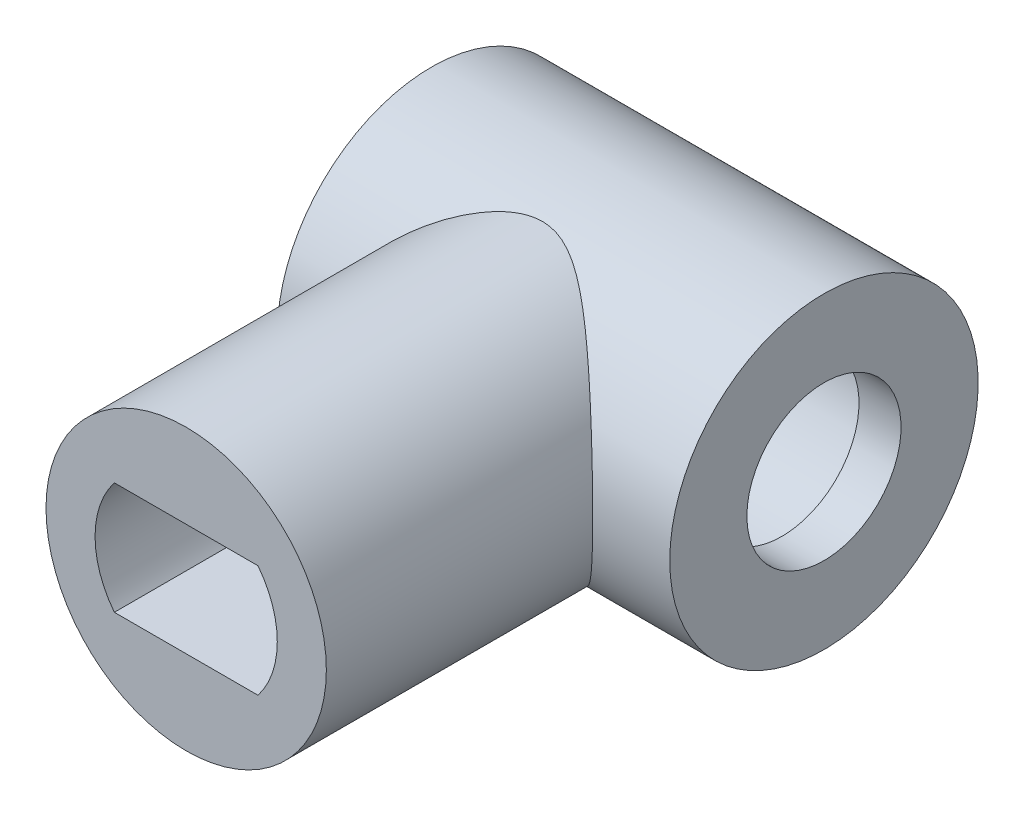
ISO-10303-21;
HEADER;
FILE_DESCRIPTION(('STEP AP214'),'2;1');
FILE_NAME('part.step','',(''),(''),'','','');
FILE_SCHEMA(('AUTOMOTIVE_DESIGN { 1 0 10303 214 1 1 1 1 }'));
ENDSEC;
DATA;
#1=APPLICATION_CONTEXT('core data for automotive mechanical design processes');
#2=APPLICATION_PROTOCOL_DEFINITION('international standard','automotive_design',2000,#1);
#3=PRODUCT_CONTEXT('',#1,'mechanical');
#4=PRODUCT('Part','Part','',(#3));
#5=PRODUCT_RELATED_PRODUCT_CATEGORY('part','',(#4));
#6=PRODUCT_DEFINITION_FORMATION('','',#4);
#7=PRODUCT_DEFINITION_CONTEXT('part definition',#1,'design');
#8=PRODUCT_DEFINITION('design','',#6,#7);
#9=PRODUCT_DEFINITION_SHAPE('','',#8);
#10=(LENGTH_UNIT() NAMED_UNIT(*) SI_UNIT(.MILLI.,.METRE.));
#11=(NAMED_UNIT(*) PLANE_ANGLE_UNIT() SI_UNIT($,.RADIAN.));
#12=(NAMED_UNIT(*) SI_UNIT($,.STERADIAN.) SOLID_ANGLE_UNIT());
#13=UNCERTAINTY_MEASURE_WITH_UNIT(LENGTH_MEASURE(1.E-05),#10,'distance_accuracy_value','');
#14=(GEOMETRIC_REPRESENTATION_CONTEXT(3) GLOBAL_UNCERTAINTY_ASSIGNED_CONTEXT((#13)) GLOBAL_UNIT_ASSIGNED_CONTEXT((#10,
#11,#12)) REPRESENTATION_CONTEXT('',''));
#15=CARTESIAN_POINT('',(0.,0.,0.));
#16=DIRECTION('',(0.,0.,1.));
#17=DIRECTION('',(1.,0.,0.));
#18=AXIS2_PLACEMENT_3D('',#15,#16,#17);
#19=CARTESIAN_POINT('',(10.,3.2,0.));
#20=DIRECTION('',(1.,0.,0.));
#21=DIRECTION('',(0.,0.,-1.));
#22=AXIS2_PLACEMENT_3D('',#19,#20,#21);
#23=PLANE('',#22);
#24=CARTESIAN_POINT('',(10.,0.,0.));
#25=DIRECTION('',(-1.,0.,0.));
#26=DIRECTION('',(0.,0.,1.));
#27=AXIS2_PLACEMENT_3D('',#24,#25,#26);
#28=CIRCLE('',#27,2.2);
#29=CARTESIAN_POINT('',(10.,0.,2.2));
#30=VERTEX_POINT('',#29);
#31=EDGE_CURVE('E109',#30,#30,#28,.T.);
#32=ORIENTED_EDGE('',*,*,#31,.F.);
#33=EDGE_LOOP('',(#32));
#34=FACE_BOUND('',#33,.T.);
#35=CARTESIAN_POINT('',(10.,0.,0.));
#36=DIRECTION('',(-1.,0.,0.));
#37=DIRECTION('',(0.,0.,1.));
#38=AXIS2_PLACEMENT_3D('',#35,#36,#37);
#39=CIRCLE('',#38,3.2);
#40=CARTESIAN_POINT('',(10.,0.,3.2));
#41=VERTEX_POINT('',#40);
#42=EDGE_CURVE('E49',#41,#41,#39,.T.);
#43=ORIENTED_EDGE('',*,*,#42,.T.);
#44=EDGE_LOOP('',(#43));
#45=FACE_BOUND('',#44,.T.);
#46=ADVANCED_FACE('F39',(#34,#45),#23,.F.);
#47=CARTESIAN_POINT('',(0.,0.,0.));
#48=DIRECTION('',(-1.,0.,0.));
#49=DIRECTION('',(0.,0.,1.));
#50=AXIS2_PLACEMENT_3D('',#47,#48,#49);
#51=CYLINDRICAL_SURFACE('',#50,3.2);
#52=ORIENTED_EDGE('',*,*,#42,.F.);
#53=EDGE_LOOP('',(#52));
#54=FACE_BOUND('',#53,.T.);
#55=CARTESIAN_POINT('',(0.,0.,0.));
#56=DIRECTION('',(-1.,0.,0.));
#57=DIRECTION('',(0.,0.,1.));
#58=AXIS2_PLACEMENT_3D('',#55,#56,#57);
#59=CIRCLE('',#58,3.2);
#60=CARTESIAN_POINT('',(0.,0.,3.2));
#61=VERTEX_POINT('',#60);
#62=EDGE_CURVE('E122',#61,#61,#59,.T.);
#63=ORIENTED_EDGE('',*,*,#62,.T.);
#64=EDGE_LOOP('',(#63));
#65=FACE_BOUND('',#64,.T.);
#66=ADVANCED_FACE('F157',(#54,#65),#51,.F.);
#67=CARTESIAN_POINT('',(0.,3.2,0.));
#68=DIRECTION('',(-1.,0.,0.));
#69=DIRECTION('',(0.,0.,1.));
#70=AXIS2_PLACEMENT_3D('',#67,#68,#69);
#71=PLANE('',#70);
#72=CARTESIAN_POINT('',(0.,0.,0.));
#73=DIRECTION('',(-1.,0.,0.));
#74=DIRECTION('',(0.,0.,1.));
#75=AXIS2_PLACEMENT_3D('',#72,#73,#74);
#76=CIRCLE('',#75,4.4);
#77=CARTESIAN_POINT('',(0.,0.,4.4));
#78=VERTEX_POINT('',#77);
#79=EDGE_CURVE('E119',#78,#78,#76,.T.);
#80=ORIENTED_EDGE('',*,*,#79,.T.);
#81=EDGE_LOOP('',(#80));
#82=FACE_BOUND('',#81,.T.);
#83=ORIENTED_EDGE('',*,*,#62,.F.);
#84=EDGE_LOOP('',(#83));
#85=FACE_BOUND('',#84,.T.);
#86=ADVANCED_FACE('F152',(#82,#85),#71,.T.);
#87=CARTESIAN_POINT('',(0.,0.,0.));
#88=DIRECTION('',(-1.,0.,0.));
#89=DIRECTION('',(0.,0.,1.));
#90=AXIS2_PLACEMENT_3D('',#87,#88,#89);
#91=CYLINDRICAL_SURFACE('',#90,4.4);
#92=CARTESIAN_POINT('',(9.,0.,4.4));
#93=CARTESIAN_POINT('',(9.00000495667873,0.0924269355025383,4.40000487554974));
#94=CARTESIAN_POINT('',(8.99679350954436,0.18481759342677,4.39708449044668));
#95=CARTESIAN_POINT('',(8.98402601144917,0.368824682531485,4.38548234541791));
#96=CARTESIAN_POINT('',(8.97446893648811,0.460440986336781,4.3767996556235));
#97=CARTESIAN_POINT('',(8.94918506170048,0.642150203798754,4.35385282207964));
#98=CARTESIAN_POINT('',(8.93345523871402,0.732242348397674,4.33958594343141));
#99=CARTESIAN_POINT('',(8.89612678439834,0.91020867294481,4.30578013660612));
#100=CARTESIAN_POINT('',(8.87452549261995,0.998081827661333,4.28623881853081));
#101=CARTESIAN_POINT('',(8.80177592714933,1.25628176701697,4.22055181527461));
#102=CARTESIAN_POINT('',(8.74248074890675,1.42257729311757,4.16715916954274));
#103=CARTESIAN_POINT('',(8.60548366308125,1.74087321231155,4.04457517900178));
#104=CARTESIAN_POINT('',(8.52777444437521,1.89286789381416,3.97537755937022));
#105=CARTESIAN_POINT('',(8.32292227946022,2.23900871905591,3.79454870101168));
#106=CARTESIAN_POINT('',(8.18842773497526,2.42576883801984,3.67700386984987));
#107=CARTESIAN_POINT('',(7.96938978052159,2.68243611206565,3.48939430587899));
#108=CARTESIAN_POINT('',(7.89335840467134,2.76419200698777,3.42486300971561));
#109=CARTESIAN_POINT('',(7.73599897160089,2.92002610414236,3.29299858995467));
#110=CARTESIAN_POINT('',(7.6546715943739,2.99410528889232,3.22566582645771));
#111=CARTESIAN_POINT('',(7.48511227855945,3.13636199545127,3.08760406382723));
#112=CARTESIAN_POINT('',(7.39676152472282,3.20435536413892,3.01683234144542));
#113=CARTESIAN_POINT('',(7.21508012714858,3.33253354284147,2.87460919904179));
#114=CARTESIAN_POINT('',(7.12174936606444,3.3927181687401,2.80315776303616));
#115=CARTESIAN_POINT('',(6.93016767862329,3.50525024803966,2.6610925753316));
#116=CARTESIAN_POINT('',(6.83192540092348,3.55761087204853,2.59047760440101));
#117=CARTESIAN_POINT('',(6.62999172940966,3.65454066417509,2.45183042203371));
#118=CARTESIAN_POINT('',(6.52630358773336,3.69911441513778,2.38379671002011));
#119=CARTESIAN_POINT('',(6.3141168034587,3.77965649248952,2.25387373413747));
#120=CARTESIAN_POINT('',(6.2057064661075,3.8157371633984,2.19191143425386));
#121=CARTESIAN_POINT('',(5.98165079486313,3.87942158891921,2.07710856947748));
#122=CARTESIAN_POINT('',(5.86600903666079,3.90702949374674,2.02426354424131));
#123=CARTESIAN_POINT('',(5.64707623733092,3.9486060038683,1.94172373368419));
#124=CARTESIAN_POINT('',(5.54501640399168,3.96409364479991,1.90962279768158));
#125=CARTESIAN_POINT('',(5.33651697671554,3.98718922621181,1.86093425906485));
#126=CARTESIAN_POINT('',(5.23009229122748,3.99482198818969,1.84429780475175));
#127=CARTESIAN_POINT('',(5.01473966922593,4.00143072944787,1.82992903676676));
#128=CARTESIAN_POINT('',(4.90579844715615,4.00033618087491,1.83235073534894));
#129=CARTESIAN_POINT('',(4.69032378500602,3.98946250343548,1.8558896103991));
#130=CARTESIAN_POINT('',(4.58379618339676,3.97966423148248,1.87704799627222));
#131=CARTESIAN_POINT('',(4.33946134066213,3.94763056562593,1.94369616923829));
#132=CARTESIAN_POINT('',(4.20376591095734,3.92224117305064,1.99511225323542));
#133=CARTESIAN_POINT('',(3.94191829740211,3.85988667568206,2.1132312285633));
#134=CARTESIAN_POINT('',(3.81580717598237,3.82287490646056,2.17999544868622));
#135=CARTESIAN_POINT('',(3.57595781433542,3.74000358070732,2.31921273580782));
#136=CARTESIAN_POINT('',(3.46194841026877,3.69447684812075,2.39140488068801));
#137=CARTESIAN_POINT('',(3.24047444311271,3.59428058848201,2.5395194803184));
#138=CARTESIAN_POINT('',(3.13301524739139,3.53960369743495,2.61544490455337));
#139=CARTESIAN_POINT('',(2.92392028051076,3.42116081304487,2.76858309299831));
#140=CARTESIAN_POINT('',(2.82229316664769,3.35738177380728,2.84579756202553));
#141=CARTESIAN_POINT('',(2.62487189864361,3.22074060729745,2.9995686315408));
#142=CARTESIAN_POINT('',(2.52907597988416,3.14788124842788,3.07612542496874));
#143=CARTESIAN_POINT('',(2.33805074603652,2.98837666954528,3.23151903649429));
#144=CARTESIAN_POINT('',(2.24317989580438,2.9011754504952,3.31022866700619));
#145=CARTESIAN_POINT('',(2.06072426926884,2.71616308660379,3.46365557819293));
#146=CARTESIAN_POINT('',(1.97314156715997,2.61834893946492,3.53837172017834));
#147=CARTESIAN_POINT('',(1.80655123653238,2.41233478018047,3.68189292703265));
#148=CARTESIAN_POINT('',(1.72751560404867,2.30417101850617,3.75071713183785));
#149=CARTESIAN_POINT('',(1.57906887785961,2.07740274916348,3.88091515048026));
#150=CARTESIAN_POINT('',(1.50965052635416,1.95880622644238,3.94229457820671));
#151=CARTESIAN_POINT('',(1.36656052738161,1.68162166443115,4.06946661470496));
#152=CARTESIAN_POINT('',(1.29587708492558,1.52027294779555,4.13277388417316));
#153=CARTESIAN_POINT('',(1.20539397604715,1.26844588164932,4.21412686239755));
#154=CARTESIAN_POINT('',(1.17781938390443,1.18285170735497,4.23898008717018));
#155=CARTESIAN_POINT('',(1.12824806362905,1.00881475714988,4.28373063906397));
#156=CARTESIAN_POINT('',(1.10624873030752,0.920373333547553,4.30363028080188));
#157=CARTESIAN_POINT('',(1.06806509192615,0.740540970068422,4.33820772698532));
#158=CARTESIAN_POINT('',(1.05192429243594,0.649133243278533,4.3528464562056));
#159=CARTESIAN_POINT('',(1.02599773157315,0.464725161600254,4.37637570031014));
#160=CARTESIAN_POINT('',(1.0162091368461,0.37172553579214,4.38526877799244));
#161=CARTESIAN_POINT('',(1.00317873940519,0.184898335577167,4.39710959411491));
#162=CARTESIAN_POINT('',(0.999936349759784,0.0910708361550037,4.40005786556528));
#163=CARTESIAN_POINT('',(1.00006554058709,-0.0965704375403817,4.39994041593773));
#164=CARTESIAN_POINT('',(1.00343661374991,-0.190384212314343,4.39687515614974));
#165=CARTESIAN_POINT('',(1.0160533625176,-0.367780730560153,4.38541043170609));
#166=CARTESIAN_POINT('',(1.02467554325451,-0.451445400618304,4.37757715055996));
#167=CARTESIAN_POINT('',(1.04706422291375,-0.617521237121477,4.35725600960193));
#168=CARTESIAN_POINT('',(1.06083242779959,-0.699931978436131,4.34476660623791));
#169=CARTESIAN_POINT('',(1.1095493825725,-0.944423116664726,4.30062915466082));
#170=CARTESIAN_POINT('',(1.15192139917521,-1.10390911935219,4.26230185895657));
#171=CARTESIAN_POINT('',(1.25596553695522,-1.41796703910068,4.1686043796883));
#172=CARTESIAN_POINT('',(1.31828645747675,-1.57214630351034,4.1126624929313));
#173=CARTESIAN_POINT('',(1.45876141031402,-1.86717957911624,3.98740155055454));
#174=CARTESIAN_POINT('',(1.5369222052489,-2.00802786102409,3.91807678189679));
#175=CARTESIAN_POINT('',(1.75010845314288,-2.34428955000488,3.73067943868791));
#176=CARTESIAN_POINT('',(1.89372207953599,-2.53057443649464,3.6058567003314));
#177=CARTESIAN_POINT('',(2.12672647231955,-2.78525260185442,3.40793795579186));
#178=CARTESIAN_POINT('',(2.20750102553534,-2.86615464302839,3.34004057279201));
#179=CARTESIAN_POINT('',(2.37447770621724,-3.01984956548747,3.20174469328733));
#180=CARTESIAN_POINT('',(2.46067887933357,-3.09264386643508,3.13134663750568));
#181=CARTESIAN_POINT('',(2.64029935988816,-3.23187932039177,2.98751047176767));
#182=CARTESIAN_POINT('',(2.73384204852755,-3.29812671303548,2.91403992788473));
#183=CARTESIAN_POINT('',(2.92627341578207,-3.42239426527572,2.76703371847698));
#184=CARTESIAN_POINT('',(3.02516421030981,-3.48041113518645,2.693498038668));
#185=CARTESIAN_POINT('',(3.22829528874312,-3.58807061953613,2.54831135898672));
#186=CARTESIAN_POINT('',(3.33252173948388,-3.63773358743054,2.47665614826272));
#187=CARTESIAN_POINT('',(3.54716453559291,-3.72865238232166,2.33752683398575));
#188=CARTESIAN_POINT('',(3.65757496393775,-3.76991607651709,2.2700488594336));
#189=CARTESIAN_POINT('',(3.87343095981072,-3.83956721965323,2.14988630533705));
#190=CARTESIAN_POINT('',(3.97812171245154,-3.86886467157386,2.09639106730601));
#191=CARTESIAN_POINT('',(4.19414012779336,-3.91954808817382,2.00002525600547));
#192=CARTESIAN_POINT('',(4.30545730620417,-3.94094618410311,1.9571384248309));
#193=CARTESIAN_POINT('',(4.51579510235235,-3.9717605502752,1.89371899125559));
#194=CARTESIAN_POINT('',(4.6138205299757,-3.98256994927218,1.87066771801757));
#195=CARTESIAN_POINT('',(4.81270907179516,-3.99684932204305,1.83997481130789));
#196=CARTESIAN_POINT('',(4.91356552650548,-4.00033526108255,1.8322996593338));
#197=CARTESIAN_POINT('',(5.11533385084094,-3.99961254406865,1.8338747908906));
#198=CARTESIAN_POINT('',(5.21624535352724,-3.9953869290163,1.84316237836171));
#199=CARTESIAN_POINT('',(5.41499256829596,-3.97967036837905,1.87684582282375));
#200=CARTESIAN_POINT('',(5.51282087455589,-3.9681631496967,1.90127551723667));
#201=CARTESIAN_POINT('',(5.75900059507491,-3.93029391542531,1.97876239903435));
#202=CARTESIAN_POINT('',(5.90388785115783,-3.89919061169443,2.04020460450053));
#203=CARTESIAN_POINT('',(6.18283170874697,-3.82386594575618,2.17813603587533));
#204=CARTESIAN_POINT('',(6.31683654409792,-3.77958608243236,2.25469184172399));
#205=CARTESIAN_POINT('',(6.5676609619916,-3.68230077549113,2.41009898833192));
#206=CARTESIAN_POINT('',(6.68503076547285,-3.6300029870555,2.48851666052581));
#207=CARTESIAN_POINT('',(6.91285552403752,-3.51529016731161,2.64809562404767));
#208=CARTESIAN_POINT('',(7.02330510487279,-3.4528674047052,2.72925897415834));
#209=CARTESIAN_POINT('',(7.23766095747566,-3.31796476204479,2.89175799472706));
#210=CARTESIAN_POINT('',(7.34157014225564,-3.24548940603613,2.9730935715521));
#211=CARTESIAN_POINT('',(7.54279262558137,-3.09036099949414,3.13403338242103));
#212=CARTESIAN_POINT('',(7.64010903536682,-3.00771280230163,3.21363842091846));
#213=CARTESIAN_POINT('',(7.8863819176057,-2.77712581526404,3.41817903147976));
#214=CARTESIAN_POINT('',(8.0297152591245,-2.62060191171436,3.54044026760282));
#215=CARTESIAN_POINT('',(8.2938986351855,-2.27959277165559,3.76901199890338));
#216=CARTESIAN_POINT('',(8.41479027968337,-2.09516045785005,3.87535194200721));
#217=CARTESIAN_POINT('',(8.60452770943954,-1.743018111132,4.0436568270632));
#218=CARTESIAN_POINT('',(8.67897246962466,-1.58055336019513,4.11023750359587));
#219=CARTESIAN_POINT('',(8.80677085525828,-1.24144013227172,4.22501013045973));
#220=CARTESIAN_POINT('',(8.86015370249206,-1.06481171886217,4.2732275551406));
#221=CARTESIAN_POINT('',(8.93363785096296,-0.740281114822037,4.33973766405323));
#222=CARTESIAN_POINT('',(8.95840756537768,-0.594279747553489,4.36221796159953));
#223=CARTESIAN_POINT('',(8.99158437010578,-0.298820599321929,4.39234495007653));
#224=CARTESIAN_POINT('',(8.99999198995341,-0.149362930375264,4.39999212105873));
#225=CARTESIAN_POINT('',(9.,0.,4.4));
#226=B_SPLINE_CURVE_WITH_KNOTS('',3,(#92,#93,#94,#95,#96,#97,#98,#99,#100,#101,#102,#103,#104,
#105,#106,#107,#108,#109,#110,#111,#112,#113,#114,#115,#116,#117,#118,#119,#120,#121,#122,#123,
#124,#125,#126,#127,#128,#129,#130,#131,#132,#133,#134,#135,#136,#137,#138,#139,#140,#141,#142,
#143,#144,#145,#146,#147,#148,#149,#150,#151,#152,#153,#154,#155,#156,#157,#158,#159,#160,#161,
#162,#163,#164,#165,#166,#167,#168,#169,#170,#171,#172,#173,#174,#175,#176,#177,#178,#179,#180,
#181,#182,#183,#184,#185,#186,#187,#188,#189,#190,#191,#192,#193,#194,#195,#196,#197,#198,#199,
#200,#201,#202,#203,#204,#205,#206,#207,#208,#209,#210,#211,#212,#213,#214,#215,#216,#217,#218,
#219,#220,#221,#222,#223,#224,#225),.UNSPECIFIED.,.T.,.F.,(4,2,2,2,2,2,2,2,2,2,2,2,2,2,2,2,2,2,
2,2,2,2,2,2,2,2,2,2,2,2,2,2,2,2,2,2,2,2,2,2,2,2,2,2,2,2,2,2,2,2,2,2,2,2,2,2,2,2,2,2,2,2,2,2,2,2,
4),(0.,0.277116880383664,0.554278490263938,0.831576012333312,1.10899939206551,1.65965833558117,
2.21053628051705,2.98126152333631,3.36786747253348,3.75442388000614,4.15025124788179,
4.54608794696799,4.94125061648441,5.33617992976927,5.72554773953951,6.11472451971238,
6.43790341507293,6.76005789642564,7.08481842156452,7.41029500282923,7.84976393651114,
8.29102042071044,8.71769429519995,9.14471322044245,9.57235044593278,9.99985761111959,
10.4522823264123,10.9048353637524,11.3558575928731,11.8065375765033,12.3655433986883,
12.6451564488098,12.9246386003382,13.2061556659246,13.4875470764169,13.7689132562865,
14.0502578537768,14.3033681727108,14.5565624750256,15.0625141708781,15.5869579454646,
16.1116260976852,16.905760962628,17.3043948162966,17.7029587592168,18.1110621300868,
18.519328160373,18.9265846125185,19.3334578336605,19.6963200260927,20.0586226201144,
20.3612415827705,20.6632001435091,20.9658235620866,21.2691256906698,21.7476571222824,
22.2283456614698,22.6793513883183,23.1307031326772,23.5818524068747,24.0327872714097,
24.7648071522763,25.4954559080871,26.0653884797356,26.6345275094434,27.0823658880222,
27.5301897727535),.UNSPECIFIED.);
#227=CARTESIAN_POINT('',(9.,0.,4.4));
#228=VERTEX_POINT('',#227);
#229=EDGE_CURVE('E12',#228,#228,#226,.T.);
#230=ORIENTED_EDGE('',*,*,#229,.F.);
#231=EDGE_LOOP('',(#230));
#232=FACE_BOUND('',#231,.T.);
#233=CARTESIAN_POINT('',(11.2,0.,0.));
#234=DIRECTION('',(-1.,0.,0.));
#235=DIRECTION('',(0.,0.,1.));
#236=AXIS2_PLACEMENT_3D('',#233,#234,#235);
#237=CIRCLE('',#236,4.4);
#238=CARTESIAN_POINT('',(11.2,0.,4.4));
#239=VERTEX_POINT('',#238);
#240=EDGE_CURVE('E116',#239,#239,#237,.T.);
#241=ORIENTED_EDGE('',*,*,#240,.T.);
#242=EDGE_LOOP('',(#241));
#243=FACE_BOUND('',#242,.T.);
#244=ORIENTED_EDGE('',*,*,#79,.F.);
#245=EDGE_LOOP('',(#244));
#246=FACE_BOUND('',#245,.T.);
#247=ADVANCED_FACE('F132',(#232,#243,#246),#91,.T.);
#248=CARTESIAN_POINT('',(11.2,3.2,0.));
#249=DIRECTION('',(1.,0.,0.));
#250=DIRECTION('',(0.,0.,-1.));
#251=AXIS2_PLACEMENT_3D('',#248,#249,#250);
#252=PLANE('',#251);
#253=CARTESIAN_POINT('',(11.2,0.,0.));
#254=DIRECTION('',(-1.,0.,0.));
#255=DIRECTION('',(0.,0.,1.));
#256=AXIS2_PLACEMENT_3D('',#253,#254,#255);
#257=CIRCLE('',#256,2.2);
#258=CARTESIAN_POINT('',(11.2,0.,2.2));
#259=VERTEX_POINT('',#258);
#260=EDGE_CURVE('E112',#259,#259,#257,.T.);
#261=ORIENTED_EDGE('',*,*,#260,.T.);
#262=EDGE_LOOP('',(#261));
#263=FACE_BOUND('',#262,.T.);
#264=ORIENTED_EDGE('',*,*,#240,.F.);
#265=EDGE_LOOP('',(#264));
#266=FACE_BOUND('',#265,.T.);
#267=ADVANCED_FACE('F144',(#263,#266),#252,.T.);
#268=CARTESIAN_POINT('',(0.,0.,0.));
#269=DIRECTION('',(-1.,0.,0.));
#270=DIRECTION('',(0.,0.,1.));
#271=AXIS2_PLACEMENT_3D('',#268,#269,#270);
#272=CYLINDRICAL_SURFACE('',#271,2.2);
#273=ORIENTED_EDGE('',*,*,#31,.T.);
#274=EDGE_LOOP('',(#273));
#275=FACE_BOUND('',#274,.T.);
#276=ORIENTED_EDGE('',*,*,#260,.F.);
#277=EDGE_LOOP('',(#276));
#278=FACE_BOUND('',#277,.T.);
#279=ADVANCED_FACE('F142',(#275,#278),#272,.F.);
#280=CARTESIAN_POINT('',(5.,0.,-4.401));
#281=DIRECTION('',(0.,0.,1.));
#282=DIRECTION('',(1.,0.,0.));
#283=AXIS2_PLACEMENT_3D('',#280,#281,#282);
#284=CYLINDRICAL_SURFACE('',#283,2.6);
#285=DIRECTION('',(0.,0.,1.));
#286=VECTOR('',#285,1.);
#287=CARTESIAN_POINT('',(2.95060984680808,-1.6,4.09878030638384));
#288=LINE('',#287,#286);
#289=CARTESIAN_POINT('',(2.95060984680808,-1.6,4.09878030638384));
#290=VERTEX_POINT('',#289);
#291=CARTESIAN_POINT('',(2.95060984680808,-1.6,12.));
#292=VERTEX_POINT('',#291);
#293=EDGE_CURVE('E81',#290,#292,#288,.T.);
#294=ORIENTED_EDGE('',*,*,#293,.F.);
#295=CARTESIAN_POINT('',(2.95060984680808,-1.6,4.09878030638384));
#296=CARTESIAN_POINT('',(2.90923444338961,-1.54699439474211,4.11947212715025));
#297=CARTESIAN_POINT('',(2.86982294511351,-1.49228060958251,4.1396432457573));
#298=CARTESIAN_POINT('',(2.79514421776486,-1.37956380095587,4.17856026760957));
#299=CARTESIAN_POINT('',(2.75987957720697,-1.32155875618312,4.19730527811241));
#300=CARTESIAN_POINT('',(2.6604784387689,-1.14249215710313,4.25090877287651));
#301=CARTESIAN_POINT('',(2.60302151488477,-1.01674431464653,4.28298852303423));
#302=CARTESIAN_POINT('',(2.5081830315731,-0.755169717380691,4.33677486866732));
#303=CARTESIAN_POINT('',(2.47088431435934,-0.619303943430849,4.35843861890496));
#304=CARTESIAN_POINT('',(2.41878186252541,-0.342199335925727,4.38887593163895));
#305=CARTESIAN_POINT('',(2.40391971892003,-0.200975438268,4.39768296196831));
#306=CARTESIAN_POINT('',(2.39770412300276,0.0705298016136173,4.40135749157658));
#307=CARTESIAN_POINT('',(2.4045229620477,0.200758885056573,4.39730877183339));
#308=CARTESIAN_POINT('',(2.43737468579625,0.458012796875663,4.37799862313215));
#309=CARTESIAN_POINT('',(2.463423718679,0.585034839436212,4.3627277706567));
#310=CARTESIAN_POINT('',(2.53282521406671,0.830055173518156,4.32275000817822));
#311=CARTESIAN_POINT('',(2.57585502734821,0.948175404822893,4.29821939911512));
#312=CARTESIAN_POINT('',(2.6775484797056,1.17545868550931,4.24169736067856));
#313=CARTESIAN_POINT('',(2.7362010398704,1.28462801097783,4.20971122041447));
#314=CARTESIAN_POINT('',(2.82490646412353,1.42508015532804,4.16300953006335));
#315=CARTESIAN_POINT('',(2.84891676969947,1.46106422454808,4.15050657146716));
#316=CARTESIAN_POINT('',(2.8985552874343,1.53159447987263,4.12499908699579));
#317=CARTESIAN_POINT('',(2.9241800625171,1.56614347704075,4.1119956481472));
#318=CARTESIAN_POINT('',(2.95060984680788,1.60000000000012,4.09878030638383));
#319=B_SPLINE_CURVE_WITH_KNOTS('',3,(#295,#296,#297,#298,#299,#300,#301,#302,#303,#304,#305,
#306,#307,#308,#309,#310,#311,#312,#313,#314,#315,#316,#317,#318),.UNSPECIFIED.,.F.,.F.,(4,2,2,
2,2,2,2,2,2,2,2,4),(0.,0.210961628004559,0.422054249334481,0.845684387947083,1.2710424895631,
1.69529133804845,2.08475321025071,2.47454249798571,2.85725687864827,3.2397005756844,
3.37475113975059,3.50952331885968),.UNSPECIFIED.);
#320=CARTESIAN_POINT('',(2.95060984680808,1.6,4.09878030638384));
#321=VERTEX_POINT('',#320);
#322=EDGE_CURVE('E58',#290,#321,#319,.T.);
#323=ORIENTED_EDGE('',*,*,#322,.T.);
#324=DIRECTION('',(0.,0.,1.));
#325=VECTOR('',#324,1.);
#326=CARTESIAN_POINT('',(2.95060984680808,1.6,4.09878030638384));
#327=LINE('',#326,#325);
#328=CARTESIAN_POINT('',(2.95060984680808,1.6,12.));
#329=VERTEX_POINT('',#328);
#330=EDGE_CURVE('E91',#321,#329,#327,.T.);
#331=ORIENTED_EDGE('',*,*,#330,.T.);
#332=CARTESIAN_POINT('',(5.,0.,12.));
#333=DIRECTION('',(0.,0.,1.));
#334=DIRECTION('',(1.,0.,0.));
#335=AXIS2_PLACEMENT_3D('',#332,#333,#334);
#336=CIRCLE('',#335,2.6);
#337=EDGE_CURVE('E89',#329,#292,#336,.T.);
#338=ORIENTED_EDGE('',*,*,#337,.T.);
#339=EDGE_LOOP('',(#294,#323,#331,#338));
#340=FACE_BOUND('',#339,.T.);
#341=ADVANCED_FACE('F90',(#340),#284,.F.);
#342=CARTESIAN_POINT('',(5.,0.,-4.401));
#343=DIRECTION('',(0.,0.,1.));
#344=DIRECTION('',(1.,0.,0.));
#345=AXIS2_PLACEMENT_3D('',#342,#343,#344);
#346=CYLINDRICAL_SURFACE('',#345,2.6);
#347=DIRECTION('',(0.,0.,1.));
#348=VECTOR('',#347,1.);
#349=CARTESIAN_POINT('',(7.04939015319192,1.6,4.09878030638384));
#350=LINE('',#349,#348);
#351=CARTESIAN_POINT('',(7.04939015319192,1.6,4.09878030638384));
#352=VERTEX_POINT('',#351);
#353=CARTESIAN_POINT('',(7.04939015319192,1.6,12.));
#354=VERTEX_POINT('',#353);
#355=EDGE_CURVE('E106',#352,#354,#350,.T.);
#356=ORIENTED_EDGE('',*,*,#355,.F.);
#357=CARTESIAN_POINT('',(7.04939015319192,1.6,4.09878030638384));
#358=CARTESIAN_POINT('',(7.09076555661039,1.54699439474211,4.11947212715025));
#359=CARTESIAN_POINT('',(7.13017705488649,1.49228060958251,4.1396432457573));
#360=CARTESIAN_POINT('',(7.20485578223514,1.37956380095587,4.17856026760957));
#361=CARTESIAN_POINT('',(7.24012042279303,1.32155875618312,4.19730527811241));
#362=CARTESIAN_POINT('',(7.3395215612311,1.14249215710313,4.25090877287651));
#363=CARTESIAN_POINT('',(7.39697848511523,1.01674431464653,4.28298852303423));
#364=CARTESIAN_POINT('',(7.4918169684269,0.755169717380691,4.33677486866732));
#365=CARTESIAN_POINT('',(7.52911568564066,0.619303943430849,4.35843861890496));
#366=CARTESIAN_POINT('',(7.58121813747459,0.342199335925728,4.38887593163895));
#367=CARTESIAN_POINT('',(7.59608028107997,0.200975438267999,4.39768296196831));
#368=CARTESIAN_POINT('',(7.60229587699724,-0.0705298016136176,4.40135749157658));
#369=CARTESIAN_POINT('',(7.5954770379523,-0.200758885056574,4.39730877183339));
#370=CARTESIAN_POINT('',(7.56262531420375,-0.458012796875664,4.37799862313215));
#371=CARTESIAN_POINT('',(7.536576281321,-0.585034839436212,4.3627277706567));
#372=CARTESIAN_POINT('',(7.46717478593329,-0.830055173518157,4.32275000817822));
#373=CARTESIAN_POINT('',(7.42414497265179,-0.948175404822893,4.29821939911512));
#374=CARTESIAN_POINT('',(7.3224515202944,-1.17545868550931,4.24169736067856));
#375=CARTESIAN_POINT('',(7.2637989601296,-1.28462801097783,4.20971122041447));
#376=CARTESIAN_POINT('',(7.17509353587647,-1.42508015532804,4.16300953006335));
#377=CARTESIAN_POINT('',(7.15108323030053,-1.46106422454808,4.15050657146716));
#378=CARTESIAN_POINT('',(7.1014447125657,-1.53159447987263,4.12499908699579));
#379=CARTESIAN_POINT('',(7.0758199374829,-1.56614347704075,4.1119956481472));
#380=CARTESIAN_POINT('',(7.04939015319212,-1.60000000000012,4.09878030638383));
#381=B_SPLINE_CURVE_WITH_KNOTS('',3,(#357,#358,#359,#360,#361,#362,#363,#364,#365,#366,#367,
#368,#369,#370,#371,#372,#373,#374,#375,#376,#377,#378,#379,#380),.UNSPECIFIED.,.F.,.F.,(4,2,2,
2,2,2,2,2,2,2,2,4),(0.,0.210961628004559,0.422054249334482,0.845684387947083,1.2710424895631,
1.69529133804846,2.08475321025071,2.47454249798571,2.85725687864827,3.2397005756844,
3.37475113975059,3.50952331885968),.UNSPECIFIED.);
#382=CARTESIAN_POINT('',(7.04939015319192,-1.6,4.09878030638384));
#383=VERTEX_POINT('',#382);
#384=EDGE_CURVE('E95',#352,#383,#381,.T.);
#385=ORIENTED_EDGE('',*,*,#384,.T.);
#386=DIRECTION('',(0.,0.,1.));
#387=VECTOR('',#386,1.);
#388=CARTESIAN_POINT('',(7.04939015319192,-1.6,4.09878030638384));
#389=LINE('',#388,#387);
#390=CARTESIAN_POINT('',(7.04939015319192,-1.6,12.));
#391=VERTEX_POINT('',#390);
#392=EDGE_CURVE('E76',#383,#391,#389,.T.);
#393=ORIENTED_EDGE('',*,*,#392,.T.);
#394=CARTESIAN_POINT('',(5.,0.,12.));
#395=DIRECTION('',(0.,0.,1.));
#396=DIRECTION('',(1.,0.,0.));
#397=AXIS2_PLACEMENT_3D('',#394,#395,#396);
#398=CIRCLE('',#397,2.6);
#399=EDGE_CURVE('E99',#391,#354,#398,.T.);
#400=ORIENTED_EDGE('',*,*,#399,.T.);
#401=EDGE_LOOP('',(#356,#385,#393,#400));
#402=FACE_BOUND('',#401,.T.);
#403=ADVANCED_FACE('F171',(#402),#346,.F.);
#404=CARTESIAN_POINT('',(3.,-1.6,-4.401));
#405=DIRECTION('',(0.,-1.,0.));
#406=DIRECTION('',(0.,0.,-1.));
#407=AXIS2_PLACEMENT_3D('',#404,#405,#406);
#408=PLANE('',#407);
#409=ORIENTED_EDGE('',*,*,#392,.F.);
#410=DIRECTION('',(-1.,0.,0.));
#411=VECTOR('',#410,1.);
#412=CARTESIAN_POINT('',(7.04939015319192,-1.6,4.09878030638384));
#413=LINE('',#412,#411);
#414=EDGE_CURVE('E86',#383,#290,#413,.T.);
#415=ORIENTED_EDGE('',*,*,#414,.T.);
#416=ORIENTED_EDGE('',*,*,#293,.T.);
#417=DIRECTION('',(1.,0.,0.));
#418=VECTOR('',#417,1.);
#419=CARTESIAN_POINT('',(5.,-1.6,12.));
#420=LINE('',#419,#418);
#421=EDGE_CURVE('E43',#292,#391,#420,.T.);
#422=ORIENTED_EDGE('',*,*,#421,.T.);
#423=EDGE_LOOP('',(#409,#415,#416,#422));
#424=FACE_BOUND('',#423,.T.);
#425=ADVANCED_FACE('F41',(#424),#408,.F.);
#426=CARTESIAN_POINT('',(5.,0.,-4.401));
#427=DIRECTION('',(0.,0.,1.));
#428=DIRECTION('',(1.,0.,0.));
#429=AXIS2_PLACEMENT_3D('',#426,#427,#428);
#430=CYLINDRICAL_SURFACE('',#429,4.);
#431=ORIENTED_EDGE('',*,*,#229,.T.);
#432=EDGE_LOOP('',(#431));
#433=FACE_BOUND('',#432,.T.);
#434=CARTESIAN_POINT('',(5.,0.,12.));
#435=DIRECTION('',(0.,0.,1.));
#436=DIRECTION('',(1.,0.,0.));
#437=AXIS2_PLACEMENT_3D('',#434,#435,#436);
#438=CIRCLE('',#437,4.);
#439=CARTESIAN_POINT('',(9.,0.,12.));
#440=VERTEX_POINT('',#439);
#441=EDGE_CURVE('E100',#440,#440,#438,.T.);
#442=ORIENTED_EDGE('',*,*,#441,.F.);
#443=EDGE_LOOP('',(#442));
#444=FACE_BOUND('',#443,.T.);
#445=ADVANCED_FACE('F136',(#433,#444),#430,.T.);
#446=CARTESIAN_POINT('',(5.,0.,12.));
#447=DIRECTION('',(0.,0.,1.));
#448=DIRECTION('',(1.,0.,0.));
#449=AXIS2_PLACEMENT_3D('',#446,#447,#448);
#450=PLANE('',#449);
#451=ORIENTED_EDGE('',*,*,#337,.F.);
#452=DIRECTION('',(-1.,0.,0.));
#453=VECTOR('',#452,1.);
#454=CARTESIAN_POINT('',(5.,1.6,12.));
#455=LINE('',#454,#453);
#456=EDGE_CURVE('E113',#354,#329,#455,.T.);
#457=ORIENTED_EDGE('',*,*,#456,.F.);
#458=ORIENTED_EDGE('',*,*,#399,.F.);
#459=ORIENTED_EDGE('',*,*,#421,.F.);
#460=EDGE_LOOP('',(#451,#457,#458,#459));
#461=FACE_BOUND('',#460,.T.);
#462=ORIENTED_EDGE('',*,*,#441,.T.);
#463=EDGE_LOOP('',(#462));
#464=FACE_BOUND('',#463,.T.);
#465=ADVANCED_FACE('F97',(#461,#464),#450,.T.);
#466=CARTESIAN_POINT('',(3.,1.6,-4.401));
#467=DIRECTION('',(0.,1.,0.));
#468=DIRECTION('',(0.,0.,1.));
#469=AXIS2_PLACEMENT_3D('',#466,#467,#468);
#470=PLANE('',#469);
#471=ORIENTED_EDGE('',*,*,#330,.F.);
#472=DIRECTION('',(-1.,0.,0.));
#473=VECTOR('',#472,1.);
#474=CARTESIAN_POINT('',(2.95060984680808,1.6,4.09878030638384));
#475=LINE('',#474,#473);
#476=EDGE_CURVE('E102',#321,#352,#475,.F.);
#477=ORIENTED_EDGE('',*,*,#476,.T.);
#478=ORIENTED_EDGE('',*,*,#355,.T.);
#479=ORIENTED_EDGE('',*,*,#456,.T.);
#480=EDGE_LOOP('',(#471,#477,#478,#479));
#481=FACE_BOUND('',#480,.T.);
#482=ADVANCED_FACE('F189',(#481),#470,.F.);
#483=ORIENTED_EDGE('',*,*,#322,.F.);
#484=ORIENTED_EDGE('',*,*,#414,.F.);
#485=ORIENTED_EDGE('',*,*,#384,.F.);
#486=ORIENTED_EDGE('',*,*,#476,.F.);
#487=EDGE_LOOP('',(#483,#484,#485,#486));
#488=FACE_BOUND('',#487,.T.);
#489=ADVANCED_FACE('F154',(#488),#91,.T.);
#490=CLOSED_SHELL('',(#46,#66,#86,#247,#267,#279,#341,#403,#425,#445,#465,#482,#489));
#491=MANIFOLD_SOLID_BREP('B2',#490);
#492=ADVANCED_BREP_SHAPE_REPRESENTATION('',(#18,#491),#14);
#493=SHAPE_DEFINITION_REPRESENTATION(#9,#492);
ENDSEC;
END-ISO-10303-21;
